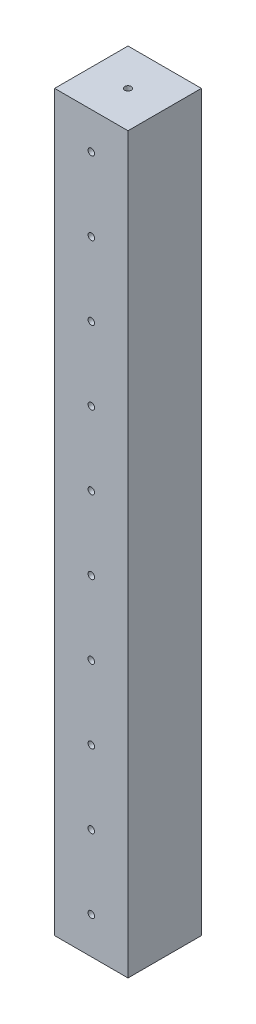
ISO-10303-21;
HEADER;
FILE_DESCRIPTION(('STEP AP214'),'2;1');
FILE_NAME('part.step','',(''),(''),'','','');
FILE_SCHEMA(('AUTOMOTIVE_DESIGN { 1 0 10303 214 1 1 1 1 }'));
ENDSEC;
DATA;
#1=APPLICATION_CONTEXT('core data for automotive mechanical design processes');
#2=APPLICATION_PROTOCOL_DEFINITION('international standard','automotive_design',2000,#1);
#3=PRODUCT_CONTEXT('',#1,'mechanical');
#4=PRODUCT('Part','Part','',(#3));
#5=PRODUCT_RELATED_PRODUCT_CATEGORY('part','',(#4));
#6=PRODUCT_DEFINITION_FORMATION('','',#4);
#7=PRODUCT_DEFINITION_CONTEXT('part definition',#1,'design');
#8=PRODUCT_DEFINITION('design','',#6,#7);
#9=PRODUCT_DEFINITION_SHAPE('','',#8);
#10=(LENGTH_UNIT() NAMED_UNIT(*) SI_UNIT(.MILLI.,.METRE.));
#11=(NAMED_UNIT(*) PLANE_ANGLE_UNIT() SI_UNIT($,.RADIAN.));
#12=(NAMED_UNIT(*) SI_UNIT($,.STERADIAN.) SOLID_ANGLE_UNIT());
#13=UNCERTAINTY_MEASURE_WITH_UNIT(LENGTH_MEASURE(1.E-05),#10,'distance_accuracy_value','');
#14=(GEOMETRIC_REPRESENTATION_CONTEXT(3) GLOBAL_UNCERTAINTY_ASSIGNED_CONTEXT((#13)) GLOBAL_UNIT_ASSIGNED_CONTEXT((#10,
#11,#12)) REPRESENTATION_CONTEXT('',''));
#15=CARTESIAN_POINT('',(0.,0.,0.));
#16=DIRECTION('',(0.,0.,1.));
#17=DIRECTION('',(1.,0.,0.));
#18=AXIS2_PLACEMENT_3D('',#15,#16,#17);
#19=CARTESIAN_POINT('',(0.,254.,0.));
#20=DIRECTION('',(0.,0.,1.));
#21=DIRECTION('',(1.,0.,0.));
#22=AXIS2_PLACEMENT_3D('',#19,#20,#21);
#23=PLANE('',#22);
#24=CARTESIAN_POINT('',(12.7,12.7,0.));
#25=DIRECTION('',(0.,0.,-1.));
#26=DIRECTION('',(-1.,0.,0.));
#27=AXIS2_PLACEMENT_3D('',#24,#25,#26);
#28=CIRCLE('',#27,1.13029999999999);
#29=CARTESIAN_POINT('',(11.5697,12.7,0.));
#30=VERTEX_POINT('',#29);
#31=EDGE_CURVE('E322',#30,#30,#28,.T.);
#32=ORIENTED_EDGE('',*,*,#31,.F.);
#33=EDGE_LOOP('',(#32));
#34=FACE_BOUND('',#33,.T.);
#35=CARTESIAN_POINT('',(12.7,38.1,0.));
#36=DIRECTION('',(0.,0.,-1.));
#37=DIRECTION('',(-1.,0.,0.));
#38=AXIS2_PLACEMENT_3D('',#35,#36,#37);
#39=CIRCLE('',#38,1.13029999999999);
#40=CARTESIAN_POINT('',(11.5697,38.1,0.));
#41=VERTEX_POINT('',#40);
#42=EDGE_CURVE('E326',#41,#41,#39,.T.);
#43=ORIENTED_EDGE('',*,*,#42,.F.);
#44=EDGE_LOOP('',(#43));
#45=FACE_BOUND('',#44,.T.);
#46=CARTESIAN_POINT('',(12.7,63.5,0.));
#47=DIRECTION('',(0.,0.,-1.));
#48=DIRECTION('',(-1.,0.,0.));
#49=AXIS2_PLACEMENT_3D('',#46,#47,#48);
#50=CIRCLE('',#49,1.13029999999999);
#51=CARTESIAN_POINT('',(11.5697,63.5,0.));
#52=VERTEX_POINT('',#51);
#53=EDGE_CURVE('E334',#52,#52,#50,.T.);
#54=ORIENTED_EDGE('',*,*,#53,.F.);
#55=EDGE_LOOP('',(#54));
#56=FACE_BOUND('',#55,.T.);
#57=CARTESIAN_POINT('',(12.7,88.9,0.));
#58=DIRECTION('',(0.,0.,-1.));
#59=DIRECTION('',(-1.,0.,0.));
#60=AXIS2_PLACEMENT_3D('',#57,#58,#59);
#61=CIRCLE('',#60,1.13029999999999);
#62=CARTESIAN_POINT('',(11.5697,88.9,0.));
#63=VERTEX_POINT('',#62);
#64=EDGE_CURVE('E340',#63,#63,#61,.T.);
#65=ORIENTED_EDGE('',*,*,#64,.F.);
#66=EDGE_LOOP('',(#65));
#67=FACE_BOUND('',#66,.T.);
#68=CARTESIAN_POINT('',(12.7,114.3,0.));
#69=DIRECTION('',(0.,0.,-1.));
#70=DIRECTION('',(-1.,0.,0.));
#71=AXIS2_PLACEMENT_3D('',#68,#69,#70);
#72=CIRCLE('',#71,1.13029999999999);
#73=CARTESIAN_POINT('',(11.5697,114.3,0.));
#74=VERTEX_POINT('',#73);
#75=EDGE_CURVE('E181',#74,#74,#72,.T.);
#76=ORIENTED_EDGE('',*,*,#75,.F.);
#77=EDGE_LOOP('',(#76));
#78=FACE_BOUND('',#77,.T.);
#79=CARTESIAN_POINT('',(12.7,165.1,0.));
#80=DIRECTION('',(0.,0.,-1.));
#81=DIRECTION('',(-1.,0.,0.));
#82=AXIS2_PLACEMENT_3D('',#79,#80,#81);
#83=CIRCLE('',#82,1.13029999999999);
#84=CARTESIAN_POINT('',(11.5697,165.1,0.));
#85=VERTEX_POINT('',#84);
#86=EDGE_CURVE('E178',#85,#85,#83,.T.);
#87=ORIENTED_EDGE('',*,*,#86,.F.);
#88=EDGE_LOOP('',(#87));
#89=FACE_BOUND('',#88,.T.);
#90=CARTESIAN_POINT('',(12.7,190.5,0.));
#91=DIRECTION('',(0.,0.,-1.));
#92=DIRECTION('',(-1.,0.,0.));
#93=AXIS2_PLACEMENT_3D('',#90,#91,#92);
#94=CIRCLE('',#93,1.13029999999999);
#95=CARTESIAN_POINT('',(11.5697,190.5,0.));
#96=VERTEX_POINT('',#95);
#97=EDGE_CURVE('E192',#96,#96,#94,.T.);
#98=ORIENTED_EDGE('',*,*,#97,.F.);
#99=EDGE_LOOP('',(#98));
#100=FACE_BOUND('',#99,.T.);
#101=CARTESIAN_POINT('',(12.7,215.9,0.));
#102=DIRECTION('',(0.,0.,-1.));
#103=DIRECTION('',(-1.,0.,0.));
#104=AXIS2_PLACEMENT_3D('',#101,#102,#103);
#105=CIRCLE('',#104,1.13029999999999);
#106=CARTESIAN_POINT('',(11.5697,215.9,0.));
#107=VERTEX_POINT('',#106);
#108=EDGE_CURVE('E200',#107,#107,#105,.T.);
#109=ORIENTED_EDGE('',*,*,#108,.F.);
#110=EDGE_LOOP('',(#109));
#111=FACE_BOUND('',#110,.T.);
#112=CARTESIAN_POINT('',(12.7,241.3,0.));
#113=DIRECTION('',(0.,0.,-1.));
#114=DIRECTION('',(-1.,0.,0.));
#115=AXIS2_PLACEMENT_3D('',#112,#113,#114);
#116=CIRCLE('',#115,1.13029999999999);
#117=CARTESIAN_POINT('',(11.5697,241.3,0.));
#118=VERTEX_POINT('',#117);
#119=EDGE_CURVE('E208',#118,#118,#116,.T.);
#120=ORIENTED_EDGE('',*,*,#119,.F.);
#121=EDGE_LOOP('',(#120));
#122=FACE_BOUND('',#121,.T.);
#123=DIRECTION('',(-1.,0.,0.));
#124=VECTOR('',#123,1.);
#125=CARTESIAN_POINT('',(0.,0.,0.));
#126=LINE('',#125,#124);
#127=CARTESIAN_POINT('',(25.4,0.,0.));
#128=VERTEX_POINT('',#127);
#129=CARTESIAN_POINT('',(0.,0.,0.));
#130=VERTEX_POINT('',#129);
#131=EDGE_CURVE('E87',#128,#130,#126,.T.);
#132=ORIENTED_EDGE('',*,*,#131,.T.);
#133=DIRECTION('',(0.,-1.,0.));
#134=VECTOR('',#133,1.);
#135=CARTESIAN_POINT('',(0.,254.,0.));
#136=LINE('',#135,#134);
#137=CARTESIAN_POINT('',(0.,254.,0.));
#138=VERTEX_POINT('',#137);
#139=EDGE_CURVE('E139',#138,#130,#136,.T.);
#140=ORIENTED_EDGE('',*,*,#139,.F.);
#141=DIRECTION('',(-1.,0.,0.));
#142=VECTOR('',#141,1.);
#143=CARTESIAN_POINT('',(0.,254.,0.));
#144=LINE('',#143,#142);
#145=CARTESIAN_POINT('',(25.4,254.,0.));
#146=VERTEX_POINT('',#145);
#147=EDGE_CURVE('E63',#146,#138,#144,.T.);
#148=ORIENTED_EDGE('',*,*,#147,.F.);
#149=DIRECTION('',(0.,-1.,0.));
#150=VECTOR('',#149,1.);
#151=CARTESIAN_POINT('',(25.4,254.,0.));
#152=LINE('',#151,#150);
#153=EDGE_CURVE('E152',#146,#128,#152,.T.);
#154=ORIENTED_EDGE('',*,*,#153,.T.);
#155=EDGE_LOOP('',(#132,#140,#148,#154));
#156=FACE_BOUND('',#155,.T.);
#157=CARTESIAN_POINT('',(12.7,139.7,0.));
#158=DIRECTION('',(0.,0.,-1.));
#159=DIRECTION('',(-1.,0.,0.));
#160=AXIS2_PLACEMENT_3D('',#157,#158,#159);
#161=CIRCLE('',#160,1.13029999999999);
#162=CARTESIAN_POINT('',(11.5697,139.7,0.));
#163=VERTEX_POINT('',#162);
#164=EDGE_CURVE('E169',#163,#163,#161,.T.);
#165=ORIENTED_EDGE('',*,*,#164,.F.);
#166=EDGE_LOOP('',(#165));
#167=FACE_BOUND('',#166,.T.);
#168=ADVANCED_FACE('F45',(#34,#45,#56,#67,#78,#89,#100,#111,#122,#156,#167),#23,.F.);
#169=CARTESIAN_POINT('',(0.,254.,0.));
#170=DIRECTION('',(1.,0.,0.));
#171=DIRECTION('',(0.,0.,-1.));
#172=AXIS2_PLACEMENT_3D('',#169,#170,#171);
#173=PLANE('',#172);
#174=DIRECTION('',(0.,0.,1.));
#175=VECTOR('',#174,1.);
#176=CARTESIAN_POINT('',(0.,0.,0.));
#177=LINE('',#176,#175);
#178=CARTESIAN_POINT('',(0.,0.,25.4));
#179=VERTEX_POINT('',#178);
#180=EDGE_CURVE('E128',#130,#179,#177,.T.);
#181=ORIENTED_EDGE('',*,*,#180,.T.);
#182=DIRECTION('',(0.,-1.,0.));
#183=VECTOR('',#182,1.);
#184=CARTESIAN_POINT('',(0.,254.,25.4));
#185=LINE('',#184,#183);
#186=CARTESIAN_POINT('',(0.,254.,25.4));
#187=VERTEX_POINT('',#186);
#188=EDGE_CURVE('E11',#187,#179,#185,.T.);
#189=ORIENTED_EDGE('',*,*,#188,.F.);
#190=DIRECTION('',(0.,0.,1.));
#191=VECTOR('',#190,1.);
#192=CARTESIAN_POINT('',(0.,254.,0.));
#193=LINE('',#192,#191);
#194=EDGE_CURVE('E129',#138,#187,#193,.T.);
#195=ORIENTED_EDGE('',*,*,#194,.F.);
#196=ORIENTED_EDGE('',*,*,#139,.T.);
#197=EDGE_LOOP('',(#181,#189,#195,#196));
#198=FACE_BOUND('',#197,.T.);
#199=ADVANCED_FACE('F47',(#198),#173,.F.);
#200=CARTESIAN_POINT('',(0.,254.,25.4));
#201=DIRECTION('',(0.,0.,-1.));
#202=DIRECTION('',(-1.,0.,0.));
#203=AXIS2_PLACEMENT_3D('',#200,#201,#202);
#204=PLANE('',#203);
#205=CARTESIAN_POINT('',(12.7,12.7,25.4));
#206=DIRECTION('',(0.,0.,-1.));
#207=DIRECTION('',(-1.,0.,0.));
#208=AXIS2_PLACEMENT_3D('',#205,#206,#207);
#209=CIRCLE('',#208,1.1303);
#210=CARTESIAN_POINT('',(11.5697,12.7,25.4));
#211=VERTEX_POINT('',#210);
#212=EDGE_CURVE('E257',#211,#211,#209,.T.);
#213=ORIENTED_EDGE('',*,*,#212,.T.);
#214=EDGE_LOOP('',(#213));
#215=FACE_BOUND('',#214,.T.);
#216=CARTESIAN_POINT('',(12.7,38.1,25.4));
#217=DIRECTION('',(0.,0.,-1.));
#218=DIRECTION('',(-1.,0.,0.));
#219=AXIS2_PLACEMENT_3D('',#216,#217,#218);
#220=CIRCLE('',#219,1.1303);
#221=CARTESIAN_POINT('',(11.5697,38.1,25.4));
#222=VERTEX_POINT('',#221);
#223=EDGE_CURVE('E261',#222,#222,#220,.T.);
#224=ORIENTED_EDGE('',*,*,#223,.T.);
#225=EDGE_LOOP('',(#224));
#226=FACE_BOUND('',#225,.T.);
#227=CARTESIAN_POINT('',(12.7,63.5,25.4));
#228=DIRECTION('',(0.,0.,-1.));
#229=DIRECTION('',(-1.,0.,0.));
#230=AXIS2_PLACEMENT_3D('',#227,#228,#229);
#231=CIRCLE('',#230,1.1303);
#232=CARTESIAN_POINT('',(11.5697,63.5,25.4));
#233=VERTEX_POINT('',#232);
#234=EDGE_CURVE('E265',#233,#233,#231,.T.);
#235=ORIENTED_EDGE('',*,*,#234,.T.);
#236=EDGE_LOOP('',(#235));
#237=FACE_BOUND('',#236,.T.);
#238=CARTESIAN_POINT('',(12.7,88.9,25.4));
#239=DIRECTION('',(0.,0.,-1.));
#240=DIRECTION('',(-1.,0.,0.));
#241=AXIS2_PLACEMENT_3D('',#238,#239,#240);
#242=CIRCLE('',#241,1.1303);
#243=CARTESIAN_POINT('',(11.5697,88.9,25.4));
#244=VERTEX_POINT('',#243);
#245=EDGE_CURVE('E269',#244,#244,#242,.T.);
#246=ORIENTED_EDGE('',*,*,#245,.T.);
#247=EDGE_LOOP('',(#246));
#248=FACE_BOUND('',#247,.T.);
#249=CARTESIAN_POINT('',(12.7,114.3,25.4));
#250=DIRECTION('',(0.,0.,-1.));
#251=DIRECTION('',(-1.,0.,0.));
#252=AXIS2_PLACEMENT_3D('',#249,#250,#251);
#253=CIRCLE('',#252,1.1303);
#254=CARTESIAN_POINT('',(11.5697,114.3,25.4));
#255=VERTEX_POINT('',#254);
#256=EDGE_CURVE('E173',#255,#255,#253,.T.);
#257=ORIENTED_EDGE('',*,*,#256,.T.);
#258=EDGE_LOOP('',(#257));
#259=FACE_BOUND('',#258,.T.);
#260=CARTESIAN_POINT('',(12.7,139.7,25.4));
#261=DIRECTION('',(0.,0.,-1.));
#262=DIRECTION('',(-1.,0.,0.));
#263=AXIS2_PLACEMENT_3D('',#260,#261,#262);
#264=CIRCLE('',#263,1.1303);
#265=CARTESIAN_POINT('',(11.5697,139.7,25.4));
#266=VERTEX_POINT('',#265);
#267=EDGE_CURVE('E172',#266,#266,#264,.T.);
#268=ORIENTED_EDGE('',*,*,#267,.T.);
#269=EDGE_LOOP('',(#268));
#270=FACE_BOUND('',#269,.T.);
#271=CARTESIAN_POINT('',(12.7,165.1,25.4));
#272=DIRECTION('',(0.,0.,-1.));
#273=DIRECTION('',(-1.,0.,0.));
#274=AXIS2_PLACEMENT_3D('',#271,#272,#273);
#275=CIRCLE('',#274,1.1303);
#276=CARTESIAN_POINT('',(11.5697,165.1,25.4));
#277=VERTEX_POINT('',#276);
#278=EDGE_CURVE('E188',#277,#277,#275,.T.);
#279=ORIENTED_EDGE('',*,*,#278,.T.);
#280=EDGE_LOOP('',(#279));
#281=FACE_BOUND('',#280,.T.);
#282=CARTESIAN_POINT('',(12.7,190.5,25.4));
#283=DIRECTION('',(0.,0.,-1.));
#284=DIRECTION('',(-1.,0.,0.));
#285=AXIS2_PLACEMENT_3D('',#282,#283,#284);
#286=CIRCLE('',#285,1.1303);
#287=CARTESIAN_POINT('',(11.5697,190.5,25.4));
#288=VERTEX_POINT('',#287);
#289=EDGE_CURVE('E196',#288,#288,#286,.T.);
#290=ORIENTED_EDGE('',*,*,#289,.T.);
#291=EDGE_LOOP('',(#290));
#292=FACE_BOUND('',#291,.T.);
#293=CARTESIAN_POINT('',(12.7,215.9,25.4));
#294=DIRECTION('',(0.,0.,-1.));
#295=DIRECTION('',(-1.,0.,0.));
#296=AXIS2_PLACEMENT_3D('',#293,#294,#295);
#297=CIRCLE('',#296,1.1303);
#298=CARTESIAN_POINT('',(11.5697,215.9,25.4));
#299=VERTEX_POINT('',#298);
#300=EDGE_CURVE('E204',#299,#299,#297,.T.);
#301=ORIENTED_EDGE('',*,*,#300,.T.);
#302=EDGE_LOOP('',(#301));
#303=FACE_BOUND('',#302,.T.);
#304=CARTESIAN_POINT('',(12.7,241.3,25.4));
#305=DIRECTION('',(0.,0.,-1.));
#306=DIRECTION('',(-1.,0.,0.));
#307=AXIS2_PLACEMENT_3D('',#304,#305,#306);
#308=CIRCLE('',#307,1.1303);
#309=CARTESIAN_POINT('',(11.5697,241.3,25.4));
#310=VERTEX_POINT('',#309);
#311=EDGE_CURVE('E121',#310,#310,#308,.T.);
#312=ORIENTED_EDGE('',*,*,#311,.T.);
#313=EDGE_LOOP('',(#312));
#314=FACE_BOUND('',#313,.T.);
#315=DIRECTION('',(1.,0.,0.));
#316=VECTOR('',#315,1.);
#317=CARTESIAN_POINT('',(0.,0.,25.4));
#318=LINE('',#317,#316);
#319=CARTESIAN_POINT('',(25.4,0.,25.4));
#320=VERTEX_POINT('',#319);
#321=EDGE_CURVE('E143',#179,#320,#318,.T.);
#322=ORIENTED_EDGE('',*,*,#321,.T.);
#323=DIRECTION('',(0.,-1.,0.));
#324=VECTOR('',#323,1.);
#325=CARTESIAN_POINT('',(25.4,254.,25.4));
#326=LINE('',#325,#324);
#327=CARTESIAN_POINT('',(25.4,254.,25.4));
#328=VERTEX_POINT('',#327);
#329=EDGE_CURVE('E55',#328,#320,#326,.T.);
#330=ORIENTED_EDGE('',*,*,#329,.F.);
#331=DIRECTION('',(1.,0.,0.));
#332=VECTOR('',#331,1.);
#333=CARTESIAN_POINT('',(0.,254.,25.4));
#334=LINE('',#333,#332);
#335=EDGE_CURVE('E94',#187,#328,#334,.T.);
#336=ORIENTED_EDGE('',*,*,#335,.F.);
#337=ORIENTED_EDGE('',*,*,#188,.T.);
#338=EDGE_LOOP('',(#322,#330,#336,#337));
#339=FACE_BOUND('',#338,.T.);
#340=ADVANCED_FACE('F215',(#215,#226,#237,#248,#259,#270,#281,#292,#303,#314,#339),#204,.F.);
#341=CARTESIAN_POINT('',(25.4,254.,0.));
#342=DIRECTION('',(-1.,0.,0.));
#343=DIRECTION('',(0.,0.,1.));
#344=AXIS2_PLACEMENT_3D('',#341,#342,#343);
#345=PLANE('',#344);
#346=DIRECTION('',(0.,0.,-1.));
#347=VECTOR('',#346,1.);
#348=CARTESIAN_POINT('',(25.4,0.,0.));
#349=LINE('',#348,#347);
#350=EDGE_CURVE('E81',#320,#128,#349,.T.);
#351=ORIENTED_EDGE('',*,*,#350,.T.);
#352=ORIENTED_EDGE('',*,*,#153,.F.);
#353=DIRECTION('',(0.,0.,-1.));
#354=VECTOR('',#353,1.);
#355=CARTESIAN_POINT('',(25.4,254.,0.));
#356=LINE('',#355,#354);
#357=EDGE_CURVE('E134',#328,#146,#356,.T.);
#358=ORIENTED_EDGE('',*,*,#357,.F.);
#359=ORIENTED_EDGE('',*,*,#329,.T.);
#360=EDGE_LOOP('',(#351,#352,#358,#359));
#361=FACE_BOUND('',#360,.T.);
#362=ADVANCED_FACE('F156',(#361),#345,.F.);
#363=CARTESIAN_POINT('',(0.,254.,0.));
#364=DIRECTION('',(0.,1.,0.));
#365=DIRECTION('',(0.,0.,1.));
#366=AXIS2_PLACEMENT_3D('',#363,#364,#365);
#367=PLANE('',#366);
#368=CARTESIAN_POINT('',(12.7,254.,12.7));
#369=DIRECTION('',(0.,1.,0.));
#370=DIRECTION('',(0.,0.,1.));
#371=AXIS2_PLACEMENT_3D('',#368,#369,#370);
#372=CIRCLE('',#371,1.1303);
#373=CARTESIAN_POINT('',(12.7,254.,13.8303));
#374=VERTEX_POINT('',#373);
#375=EDGE_CURVE('E113',#374,#374,#372,.T.);
#376=ORIENTED_EDGE('',*,*,#375,.F.);
#377=EDGE_LOOP('',(#376));
#378=FACE_BOUND('',#377,.T.);
#379=ORIENTED_EDGE('',*,*,#194,.T.);
#380=ORIENTED_EDGE('',*,*,#335,.T.);
#381=ORIENTED_EDGE('',*,*,#357,.T.);
#382=ORIENTED_EDGE('',*,*,#147,.T.);
#383=EDGE_LOOP('',(#379,#380,#381,#382));
#384=FACE_BOUND('',#383,.T.);
#385=ADVANCED_FACE('F241',(#378,#384),#367,.T.);
#386=CARTESIAN_POINT('',(0.,0.,0.));
#387=DIRECTION('',(0.,1.,0.));
#388=DIRECTION('',(0.,0.,1.));
#389=AXIS2_PLACEMENT_3D('',#386,#387,#388);
#390=PLANE('',#389);
#391=CARTESIAN_POINT('',(12.7,0.,12.7));
#392=DIRECTION('',(0.,-1.,0.));
#393=DIRECTION('',(0.,0.,-1.));
#394=AXIS2_PLACEMENT_3D('',#391,#392,#393);
#395=CIRCLE('',#394,1.1303);
#396=CARTESIAN_POINT('',(12.7,0.,11.5697));
#397=VERTEX_POINT('',#396);
#398=EDGE_CURVE('E112',#397,#397,#395,.T.);
#399=ORIENTED_EDGE('',*,*,#398,.F.);
#400=EDGE_LOOP('',(#399));
#401=FACE_BOUND('',#400,.T.);
#402=ORIENTED_EDGE('',*,*,#180,.F.);
#403=ORIENTED_EDGE('',*,*,#131,.F.);
#404=ORIENTED_EDGE('',*,*,#350,.F.);
#405=ORIENTED_EDGE('',*,*,#321,.F.);
#406=EDGE_LOOP('',(#402,#403,#404,#405));
#407=FACE_BOUND('',#406,.T.);
#408=ADVANCED_FACE('F159',(#401,#407),#390,.F.);
#409=CARTESIAN_POINT('',(12.7,7.6,12.7));
#410=DIRECTION('',(0.,-1.,0.));
#411=DIRECTION('',(0.,0.,-1.));
#412=AXIS2_PLACEMENT_3D('',#409,#410,#411);
#413=CONICAL_SURFACE('',#412,1.1303,1.02974425867665);
#414=CARTESIAN_POINT('',(12.7,8.27915275768685,12.7));
#415=VERTEX_POINT('',#414);
#416=VERTEX_LOOP('',#415);
#417=FACE_BOUND('',#416,.T.);
#418=CARTESIAN_POINT('',(12.7,7.6,12.7));
#419=DIRECTION('',(0.,-1.,0.));
#420=DIRECTION('',(0.,0.,-1.));
#421=AXIS2_PLACEMENT_3D('',#418,#419,#420);
#422=CIRCLE('',#421,1.1303);
#423=CARTESIAN_POINT('',(12.7,7.6,11.5697));
#424=VERTEX_POINT('',#423);
#425=EDGE_CURVE('E118',#424,#424,#422,.T.);
#426=ORIENTED_EDGE('',*,*,#425,.T.);
#427=EDGE_LOOP('',(#426));
#428=FACE_BOUND('',#427,.T.);
#429=ADVANCED_FACE('F236',(#417,#428),#413,.F.);
#430=CARTESIAN_POINT('',(12.7,0.,12.7));
#431=DIRECTION('',(0.,-1.,0.));
#432=DIRECTION('',(0.,0.,-1.));
#433=AXIS2_PLACEMENT_3D('',#430,#431,#432);
#434=CYLINDRICAL_SURFACE('',#433,1.1303);
#435=ORIENTED_EDGE('',*,*,#425,.F.);
#436=EDGE_LOOP('',(#435));
#437=FACE_BOUND('',#436,.T.);
#438=ORIENTED_EDGE('',*,*,#398,.T.);
#439=EDGE_LOOP('',(#438));
#440=FACE_BOUND('',#439,.T.);
#441=ADVANCED_FACE('F105',(#437,#440),#434,.F.);
#442=CARTESIAN_POINT('',(12.7,246.4,12.7));
#443=DIRECTION('',(0.,1.,0.));
#444=DIRECTION('',(0.,0.,1.));
#445=AXIS2_PLACEMENT_3D('',#442,#443,#444);
#446=CONICAL_SURFACE('',#445,1.1303,1.02974425867666);
#447=CARTESIAN_POINT('',(12.7,245.720847242313,12.7));
#448=VERTEX_POINT('',#447);
#449=VERTEX_LOOP('',#448);
#450=FACE_BOUND('',#449,.T.);
#451=CARTESIAN_POINT('',(12.7,246.4,12.7));
#452=DIRECTION('',(0.,1.,0.));
#453=DIRECTION('',(0.,0.,1.));
#454=AXIS2_PLACEMENT_3D('',#451,#452,#453);
#455=CIRCLE('',#454,1.1303);
#456=CARTESIAN_POINT('',(12.7,246.4,13.8303));
#457=VERTEX_POINT('',#456);
#458=EDGE_CURVE('E109',#457,#457,#455,.T.);
#459=ORIENTED_EDGE('',*,*,#458,.T.);
#460=EDGE_LOOP('',(#459));
#461=FACE_BOUND('',#460,.T.);
#462=ADVANCED_FACE('F101',(#450,#461),#446,.F.);
#463=CARTESIAN_POINT('',(12.7,254.,12.7));
#464=DIRECTION('',(0.,1.,0.));
#465=DIRECTION('',(0.,0.,1.));
#466=AXIS2_PLACEMENT_3D('',#463,#464,#465);
#467=CYLINDRICAL_SURFACE('',#466,1.1303);
#468=ORIENTED_EDGE('',*,*,#458,.F.);
#469=EDGE_LOOP('',(#468));
#470=FACE_BOUND('',#469,.T.);
#471=ORIENTED_EDGE('',*,*,#375,.T.);
#472=EDGE_LOOP('',(#471));
#473=FACE_BOUND('',#472,.T.);
#474=ADVANCED_FACE('F104',(#470,#473),#467,.F.);
#475=CARTESIAN_POINT('',(12.7,241.3,0.));
#476=DIRECTION('',(0.,0.,-1.));
#477=DIRECTION('',(-1.,0.,0.));
#478=AXIS2_PLACEMENT_3D('',#475,#476,#477);
#479=CYLINDRICAL_SURFACE('',#478,1.13029999999999);
#480=ORIENTED_EDGE('',*,*,#311,.F.);
#481=EDGE_LOOP('',(#480));
#482=FACE_BOUND('',#481,.T.);
#483=ORIENTED_EDGE('',*,*,#119,.T.);
#484=EDGE_LOOP('',(#483));
#485=FACE_BOUND('',#484,.T.);
#486=ADVANCED_FACE('F217',(#482,#485),#479,.F.);
#487=CARTESIAN_POINT('',(12.7,215.9,0.));
#488=DIRECTION('',(0.,0.,-1.));
#489=DIRECTION('',(-1.,0.,0.));
#490=AXIS2_PLACEMENT_3D('',#487,#488,#489);
#491=CYLINDRICAL_SURFACE('',#490,1.13029999999999);
#492=ORIENTED_EDGE('',*,*,#300,.F.);
#493=EDGE_LOOP('',(#492));
#494=FACE_BOUND('',#493,.T.);
#495=ORIENTED_EDGE('',*,*,#108,.T.);
#496=EDGE_LOOP('',(#495));
#497=FACE_BOUND('',#496,.T.);
#498=ADVANCED_FACE('F220',(#494,#497),#491,.F.);
#499=CARTESIAN_POINT('',(12.7,190.5,0.));
#500=DIRECTION('',(0.,0.,-1.));
#501=DIRECTION('',(-1.,0.,0.));
#502=AXIS2_PLACEMENT_3D('',#499,#500,#501);
#503=CYLINDRICAL_SURFACE('',#502,1.13029999999999);
#504=ORIENTED_EDGE('',*,*,#289,.F.);
#505=EDGE_LOOP('',(#504));
#506=FACE_BOUND('',#505,.T.);
#507=ORIENTED_EDGE('',*,*,#97,.T.);
#508=EDGE_LOOP('',(#507));
#509=FACE_BOUND('',#508,.T.);
#510=ADVANCED_FACE('F228',(#506,#509),#503,.F.);
#511=CARTESIAN_POINT('',(12.7,165.1,0.));
#512=DIRECTION('',(0.,0.,-1.));
#513=DIRECTION('',(-1.,0.,0.));
#514=AXIS2_PLACEMENT_3D('',#511,#512,#513);
#515=CYLINDRICAL_SURFACE('',#514,1.13029999999999);
#516=ORIENTED_EDGE('',*,*,#278,.F.);
#517=EDGE_LOOP('',(#516));
#518=FACE_BOUND('',#517,.T.);
#519=ORIENTED_EDGE('',*,*,#86,.T.);
#520=EDGE_LOOP('',(#519));
#521=FACE_BOUND('',#520,.T.);
#522=ADVANCED_FACE('F285',(#518,#521),#515,.F.);
#523=CARTESIAN_POINT('',(12.7,139.7,0.));
#524=DIRECTION('',(0.,0.,-1.));
#525=DIRECTION('',(-1.,0.,0.));
#526=AXIS2_PLACEMENT_3D('',#523,#524,#525);
#527=CYLINDRICAL_SURFACE('',#526,1.13029999999999);
#528=ORIENTED_EDGE('',*,*,#267,.F.);
#529=EDGE_LOOP('',(#528));
#530=FACE_BOUND('',#529,.T.);
#531=ORIENTED_EDGE('',*,*,#164,.T.);
#532=EDGE_LOOP('',(#531));
#533=FACE_BOUND('',#532,.T.);
#534=ADVANCED_FACE('F291',(#530,#533),#527,.F.);
#535=CARTESIAN_POINT('',(12.7,114.3,0.));
#536=DIRECTION('',(0.,0.,-1.));
#537=DIRECTION('',(-1.,0.,0.));
#538=AXIS2_PLACEMENT_3D('',#535,#536,#537);
#539=CYLINDRICAL_SURFACE('',#538,1.13029999999999);
#540=ORIENTED_EDGE('',*,*,#256,.F.);
#541=EDGE_LOOP('',(#540));
#542=FACE_BOUND('',#541,.T.);
#543=ORIENTED_EDGE('',*,*,#75,.T.);
#544=EDGE_LOOP('',(#543));
#545=FACE_BOUND('',#544,.T.);
#546=ADVANCED_FACE('F297',(#542,#545),#539,.F.);
#547=CARTESIAN_POINT('',(12.7,88.9,0.));
#548=DIRECTION('',(0.,0.,-1.));
#549=DIRECTION('',(-1.,0.,0.));
#550=AXIS2_PLACEMENT_3D('',#547,#548,#549);
#551=CYLINDRICAL_SURFACE('',#550,1.13029999999999);
#552=ORIENTED_EDGE('',*,*,#245,.F.);
#553=EDGE_LOOP('',(#552));
#554=FACE_BOUND('',#553,.T.);
#555=ORIENTED_EDGE('',*,*,#64,.T.);
#556=EDGE_LOOP('',(#555));
#557=FACE_BOUND('',#556,.T.);
#558=ADVANCED_FACE('F301',(#554,#557),#551,.F.);
#559=CARTESIAN_POINT('',(12.7,63.5,0.));
#560=DIRECTION('',(0.,0.,-1.));
#561=DIRECTION('',(-1.,0.,0.));
#562=AXIS2_PLACEMENT_3D('',#559,#560,#561);
#563=CYLINDRICAL_SURFACE('',#562,1.13029999999999);
#564=ORIENTED_EDGE('',*,*,#234,.F.);
#565=EDGE_LOOP('',(#564));
#566=FACE_BOUND('',#565,.T.);
#567=ORIENTED_EDGE('',*,*,#53,.T.);
#568=EDGE_LOOP('',(#567));
#569=FACE_BOUND('',#568,.T.);
#570=ADVANCED_FACE('F305',(#566,#569),#563,.F.);
#571=CARTESIAN_POINT('',(12.7,38.1,0.));
#572=DIRECTION('',(0.,0.,-1.));
#573=DIRECTION('',(-1.,0.,0.));
#574=AXIS2_PLACEMENT_3D('',#571,#572,#573);
#575=CYLINDRICAL_SURFACE('',#574,1.13029999999999);
#576=ORIENTED_EDGE('',*,*,#223,.F.);
#577=EDGE_LOOP('',(#576));
#578=FACE_BOUND('',#577,.T.);
#579=ORIENTED_EDGE('',*,*,#42,.T.);
#580=EDGE_LOOP('',(#579));
#581=FACE_BOUND('',#580,.T.);
#582=ADVANCED_FACE('F309',(#578,#581),#575,.F.);
#583=CARTESIAN_POINT('',(12.7,12.7,0.));
#584=DIRECTION('',(0.,0.,-1.));
#585=DIRECTION('',(-1.,0.,0.));
#586=AXIS2_PLACEMENT_3D('',#583,#584,#585);
#587=CYLINDRICAL_SURFACE('',#586,1.13029999999999);
#588=ORIENTED_EDGE('',*,*,#212,.F.);
#589=EDGE_LOOP('',(#588));
#590=FACE_BOUND('',#589,.T.);
#591=ORIENTED_EDGE('',*,*,#31,.T.);
#592=EDGE_LOOP('',(#591));
#593=FACE_BOUND('',#592,.T.);
#594=ADVANCED_FACE('F313',(#590,#593),#587,.F.);
#595=CLOSED_SHELL('',(#168,#199,#340,#362,#385,#408,#429,#441,#462,#474,#486,#498,#510,#522,
#534,#546,#558,#570,#582,#594));
#596=MANIFOLD_SOLID_BREP('B2',#595);
#597=ADVANCED_BREP_SHAPE_REPRESENTATION('',(#18,#596),#14);
#598=SHAPE_DEFINITION_REPRESENTATION(#9,#597);
ENDSEC;
END-ISO-10303-21;
